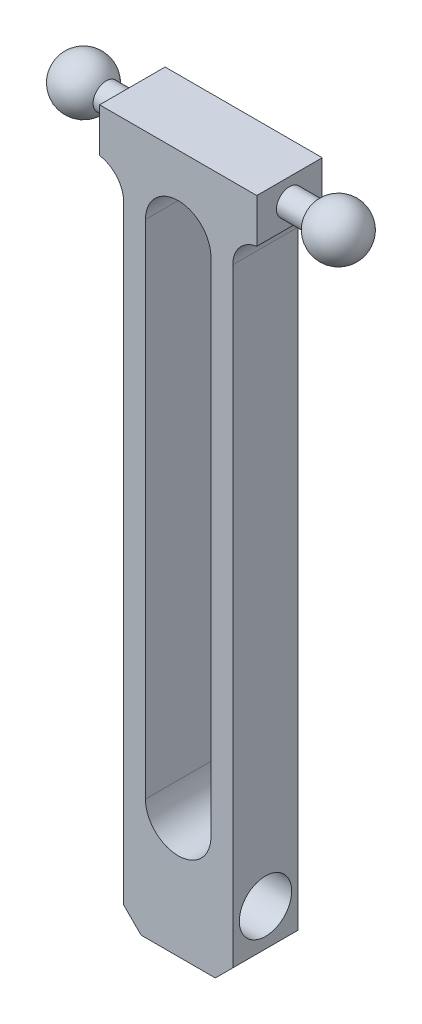
ISO-10303-21;
HEADER;
FILE_DESCRIPTION(('STEP AP214'),'2;1');
FILE_NAME('part.step','',(''),(''),'','','');
FILE_SCHEMA(('AUTOMOTIVE_DESIGN { 1 0 10303 214 1 1 1 1 }'));
ENDSEC;
DATA;
#1=APPLICATION_CONTEXT('core data for automotive mechanical design processes');
#2=APPLICATION_PROTOCOL_DEFINITION('international standard','automotive_design',2000,#1);
#3=PRODUCT_CONTEXT('',#1,'mechanical');
#4=PRODUCT('Part','Part','',(#3));
#5=PRODUCT_RELATED_PRODUCT_CATEGORY('part','',(#4));
#6=PRODUCT_DEFINITION_FORMATION('','',#4);
#7=PRODUCT_DEFINITION_CONTEXT('part definition',#1,'design');
#8=PRODUCT_DEFINITION('design','',#6,#7);
#9=PRODUCT_DEFINITION_SHAPE('','',#8);
#10=(LENGTH_UNIT() NAMED_UNIT(*) SI_UNIT(.MILLI.,.METRE.));
#11=(NAMED_UNIT(*) PLANE_ANGLE_UNIT() SI_UNIT($,.RADIAN.));
#12=(NAMED_UNIT(*) SI_UNIT($,.STERADIAN.) SOLID_ANGLE_UNIT());
#13=UNCERTAINTY_MEASURE_WITH_UNIT(LENGTH_MEASURE(1.E-05),#10,'distance_accuracy_value','');
#14=(GEOMETRIC_REPRESENTATION_CONTEXT(3) GLOBAL_UNCERTAINTY_ASSIGNED_CONTEXT((#13)) GLOBAL_UNIT_ASSIGNED_CONTEXT((#10,
#11,#12)) REPRESENTATION_CONTEXT('',''));
#15=CARTESIAN_POINT('',(0.,0.,0.));
#16=DIRECTION('',(0.,0.,1.));
#17=DIRECTION('',(1.,0.,0.));
#18=AXIS2_PLACEMENT_3D('',#15,#16,#17);
#19=CARTESIAN_POINT('',(-2.75,77.5,3.75));
#20=DIRECTION('',(-1.,0.,0.));
#21=DIRECTION('',(0.,0.,1.));
#22=AXIS2_PLACEMENT_3D('',#19,#20,#21);
#23=CYLINDRICAL_SURFACE('',#22,1.5);
#24=CARTESIAN_POINT('',(-2.75,77.5,3.75));
#25=DIRECTION('',(-1.,0.,0.));
#26=DIRECTION('',(0.,0.,1.));
#27=AXIS2_PLACEMENT_3D('',#24,#25,#26);
#28=CIRCLE('',#27,1.5);
#29=CARTESIAN_POINT('',(-2.75,77.5,5.25));
#30=VERTEX_POINT('',#29);
#31=EDGE_CURVE('E314',#30,#30,#28,.T.);
#32=ORIENTED_EDGE('',*,*,#31,.T.);
#33=EDGE_LOOP('',(#32));
#34=FACE_BOUND('',#33,.T.);
#35=CARTESIAN_POINT('',(-5.75,77.5,3.75));
#36=DIRECTION('',(-1.,0.,0.));
#37=DIRECTION('',(0.,0.,1.));
#38=AXIS2_PLACEMENT_3D('',#35,#36,#37);
#39=CIRCLE('',#38,1.5);
#40=CARTESIAN_POINT('',(-5.75,77.5,5.25));
#41=VERTEX_POINT('',#40);
#42=EDGE_CURVE('E307',#41,#41,#39,.T.);
#43=ORIENTED_EDGE('',*,*,#42,.F.);
#44=EDGE_LOOP('',(#43));
#45=FACE_BOUND('',#44,.T.);
#46=ADVANCED_FACE('F47',(#34,#45),#23,.T.);
#47=CARTESIAN_POINT('',(15.2499999999999,77.5,3.75));
#48=DIRECTION('',(1.,0.,0.));
#49=DIRECTION('',(0.,0.,-1.));
#50=AXIS2_PLACEMENT_3D('',#47,#48,#49);
#51=CYLINDRICAL_SURFACE('',#50,1.5);
#52=CARTESIAN_POINT('',(15.2499999999999,77.5,3.75));
#53=DIRECTION('',(1.,0.,0.));
#54=DIRECTION('',(0.,0.,-1.));
#55=AXIS2_PLACEMENT_3D('',#52,#53,#54);
#56=CIRCLE('',#55,1.5);
#57=CARTESIAN_POINT('',(15.2499999999999,77.5,2.25));
#58=VERTEX_POINT('',#57);
#59=EDGE_CURVE('E324',#58,#58,#56,.T.);
#60=ORIENTED_EDGE('',*,*,#59,.T.);
#61=EDGE_LOOP('',(#60));
#62=FACE_BOUND('',#61,.T.);
#63=CARTESIAN_POINT('',(18.25,77.5,3.75));
#64=DIRECTION('',(-1.,0.,0.));
#65=DIRECTION('',(0.,0.,1.));
#66=AXIS2_PLACEMENT_3D('',#63,#64,#65);
#67=CIRCLE('',#66,1.5);
#68=CARTESIAN_POINT('',(18.25,77.5,5.25));
#69=VERTEX_POINT('',#68);
#70=EDGE_CURVE('E310',#69,#69,#67,.T.);
#71=ORIENTED_EDGE('',*,*,#70,.T.);
#72=EDGE_LOOP('',(#71));
#73=FACE_BOUND('',#72,.T.);
#74=ADVANCED_FACE('F284',(#62,#73),#51,.T.);
#75=CARTESIAN_POINT('',(-8.75,80.,7.5));
#76=DIRECTION('',(0.,-1.,0.));
#77=DIRECTION('',(0.,0.,-1.));
#78=AXIS2_PLACEMENT_3D('',#75,#76,#77);
#79=PLANE('',#78);
#80=DIRECTION('',(0.,0.,-1.));
#81=VECTOR('',#80,1.);
#82=CARTESIAN_POINT('',(-2.75,80.,7.5));
#83=LINE('',#82,#81);
#84=CARTESIAN_POINT('',(-2.75,80.,7.5));
#85=VERTEX_POINT('',#84);
#86=CARTESIAN_POINT('',(-2.75,80.,0.));
#87=VERTEX_POINT('',#86);
#88=EDGE_CURVE('E179',#85,#87,#83,.T.);
#89=ORIENTED_EDGE('',*,*,#88,.F.);
#90=DIRECTION('',(-1.,0.,0.));
#91=VECTOR('',#90,1.);
#92=CARTESIAN_POINT('',(-8.75,80.,7.5));
#93=LINE('',#92,#91);
#94=CARTESIAN_POINT('',(15.2499999999999,80.,7.5));
#95=VERTEX_POINT('',#94);
#96=EDGE_CURVE('E177',#95,#85,#93,.T.);
#97=ORIENTED_EDGE('',*,*,#96,.F.);
#98=DIRECTION('',(0.,0.,1.));
#99=VECTOR('',#98,1.);
#100=CARTESIAN_POINT('',(15.2499999999999,80.,7.5));
#101=LINE('',#100,#99);
#102=CARTESIAN_POINT('',(15.2499999999999,80.,0.));
#103=VERTEX_POINT('',#102);
#104=EDGE_CURVE('E328',#103,#95,#101,.T.);
#105=ORIENTED_EDGE('',*,*,#104,.F.);
#106=DIRECTION('',(-1.,0.,0.));
#107=VECTOR('',#106,1.);
#108=CARTESIAN_POINT('',(-8.75,80.,0.));
#109=LINE('',#108,#107);
#110=EDGE_CURVE('E210',#103,#87,#109,.T.);
#111=ORIENTED_EDGE('',*,*,#110,.T.);
#112=EDGE_LOOP('',(#89,#97,#105,#111));
#113=FACE_BOUND('',#112,.T.);
#114=ADVANCED_FACE('F287',(#113),#79,.F.);
#115=CARTESIAN_POINT('',(15.75,71.75,7.5));
#116=DIRECTION('',(0.,0.,1.));
#117=DIRECTION('',(1.,0.,0.));
#118=AXIS2_PLACEMENT_3D('',#115,#116,#117);
#119=PLANE('',#118);
#120=CARTESIAN_POINT('',(6.25,71.25,7.5));
#121=DIRECTION('',(0.,0.,1.));
#122=DIRECTION('',(1.,0.,0.));
#123=AXIS2_PLACEMENT_3D('',#120,#121,#122);
#124=CIRCLE('',#123,3.75);
#125=CARTESIAN_POINT('',(10.,71.25,7.5));
#126=VERTEX_POINT('',#125);
#127=CARTESIAN_POINT('',(2.50000000000001,71.25,7.5));
#128=VERTEX_POINT('',#127);
#129=EDGE_CURVE('E344',#126,#128,#124,.T.);
#130=ORIENTED_EDGE('',*,*,#129,.F.);
#131=DIRECTION('',(0.,1.,0.));
#132=VECTOR('',#131,1.);
#133=CARTESIAN_POINT('',(10.,71.25,7.5));
#134=LINE('',#133,#132);
#135=CARTESIAN_POINT('',(10.,13.75,7.5));
#136=VERTEX_POINT('',#135);
#137=EDGE_CURVE('E353',#136,#126,#134,.T.);
#138=ORIENTED_EDGE('',*,*,#137,.F.);
#139=CARTESIAN_POINT('',(6.25000000000001,13.75,7.5));
#140=DIRECTION('',(0.,0.,1.));
#141=DIRECTION('',(1.,0.,0.));
#142=AXIS2_PLACEMENT_3D('',#139,#140,#141);
#143=CIRCLE('',#142,3.75);
#144=CARTESIAN_POINT('',(2.50000000000001,13.75,7.5));
#145=VERTEX_POINT('',#144);
#146=EDGE_CURVE('E350',#145,#136,#143,.T.);
#147=ORIENTED_EDGE('',*,*,#146,.F.);
#148=DIRECTION('',(0.,-1.,0.));
#149=VECTOR('',#148,1.);
#150=CARTESIAN_POINT('',(2.5,71.25,7.5));
#151=LINE('',#150,#149);
#152=EDGE_CURVE('E347',#128,#145,#151,.T.);
#153=ORIENTED_EDGE('',*,*,#152,.F.);
#154=EDGE_LOOP('',(#130,#138,#147,#153));
#155=FACE_BOUND('',#154,.T.);
#156=ORIENTED_EDGE('',*,*,#96,.T.);
#157=DIRECTION('',(0.,-1.,0.));
#158=VECTOR('',#157,1.);
#159=CARTESIAN_POINT('',(-2.75,71.75,7.5));
#160=LINE('',#159,#158);
#161=CARTESIAN_POINT('',(-2.75,74.9613081446663,7.5));
#162=VERTEX_POINT('',#161);
#163=EDGE_CURVE('E165',#85,#162,#160,.T.);
#164=ORIENTED_EDGE('',*,*,#163,.T.);
#165=CARTESIAN_POINT('',(-3.25,71.75,7.5));
#166=DIRECTION('',(0.,0.,-1.));
#167=DIRECTION('',(-1.,0.,0.));
#168=AXIS2_PLACEMENT_3D('',#165,#166,#167);
#169=CIRCLE('',#168,3.25);
#170=CARTESIAN_POINT('',(0.,71.75,7.5));
#171=VERTEX_POINT('',#170);
#172=EDGE_CURVE('E173',#162,#171,#169,.T.);
#173=ORIENTED_EDGE('',*,*,#172,.T.);
#174=DIRECTION('',(0.,-1.,0.));
#175=VECTOR('',#174,1.);
#176=CARTESIAN_POINT('',(0.,2.,7.5));
#177=LINE('',#176,#175);
#178=CARTESIAN_POINT('',(0.,2.,7.5));
#179=VERTEX_POINT('',#178);
#180=EDGE_CURVE('E186',#171,#179,#177,.T.);
#181=ORIENTED_EDGE('',*,*,#180,.T.);
#182=DIRECTION('',(0.707106781186548,-0.707106781186548,0.));
#183=VECTOR('',#182,1.);
#184=CARTESIAN_POINT('',(0.,2.,7.5));
#185=LINE('',#184,#183);
#186=CARTESIAN_POINT('',(2.,0.,7.5));
#187=VERTEX_POINT('',#186);
#188=EDGE_CURVE('E190',#179,#187,#185,.T.);
#189=ORIENTED_EDGE('',*,*,#188,.T.);
#190=DIRECTION('',(1.,0.,0.));
#191=VECTOR('',#190,1.);
#192=CARTESIAN_POINT('',(2.,0.,7.5));
#193=LINE('',#192,#191);
#194=CARTESIAN_POINT('',(10.5,0.,7.5));
#195=VERTEX_POINT('',#194);
#196=EDGE_CURVE('E198',#187,#195,#193,.T.);
#197=ORIENTED_EDGE('',*,*,#196,.T.);
#198=DIRECTION('',(0.707106781186548,0.707106781186548,0.));
#199=VECTOR('',#198,1.);
#200=CARTESIAN_POINT('',(10.5,0.,7.5));
#201=LINE('',#200,#199);
#202=CARTESIAN_POINT('',(12.5,2.,7.5));
#203=VERTEX_POINT('',#202);
#204=EDGE_CURVE('E200',#195,#203,#201,.T.);
#205=ORIENTED_EDGE('',*,*,#204,.T.);
#206=DIRECTION('',(0.,1.,0.));
#207=VECTOR('',#206,1.);
#208=CARTESIAN_POINT('',(12.5,2.,7.5));
#209=LINE('',#208,#207);
#210=CARTESIAN_POINT('',(12.5,71.75,7.5));
#211=VERTEX_POINT('',#210);
#212=EDGE_CURVE('E202',#203,#211,#209,.T.);
#213=ORIENTED_EDGE('',*,*,#212,.T.);
#214=CARTESIAN_POINT('',(15.75,71.75,7.5));
#215=DIRECTION('',(0.,0.,-1.));
#216=DIRECTION('',(1.,0.,0.));
#217=AXIS2_PLACEMENT_3D('',#214,#215,#216);
#218=CIRCLE('',#217,3.25);
#219=CARTESIAN_POINT('',(15.2499999999999,74.9613081446663,7.5));
#220=VERTEX_POINT('',#219);
#221=EDGE_CURVE('E193',#211,#220,#218,.T.);
#222=ORIENTED_EDGE('',*,*,#221,.T.);
#223=DIRECTION('',(0.,1.,0.));
#224=VECTOR('',#223,1.);
#225=CARTESIAN_POINT('',(15.2499999999999,71.75,7.5));
#226=LINE('',#225,#224);
#227=EDGE_CURVE('E333',#220,#95,#226,.T.);
#228=ORIENTED_EDGE('',*,*,#227,.T.);
#229=EDGE_LOOP('',(#156,#164,#173,#181,#189,#197,#205,#213,#222,#228));
#230=FACE_BOUND('',#229,.T.);
#231=ADVANCED_FACE('F172',(#155,#230),#119,.T.);
#232=CARTESIAN_POINT('',(15.75,71.75,0.));
#233=DIRECTION('',(0.,0.,1.));
#234=DIRECTION('',(1.,0.,0.));
#235=AXIS2_PLACEMENT_3D('',#232,#233,#234);
#236=PLANE('',#235);
#237=DIRECTION('',(0.,1.,0.));
#238=VECTOR('',#237,1.);
#239=CARTESIAN_POINT('',(10.,71.75,0.));
#240=LINE('',#239,#238);
#241=CARTESIAN_POINT('',(10.,13.75,0.));
#242=VERTEX_POINT('',#241);
#243=CARTESIAN_POINT('',(10.,71.25,0.));
#244=VERTEX_POINT('',#243);
#245=EDGE_CURVE('E257',#242,#244,#240,.T.);
#246=ORIENTED_EDGE('',*,*,#245,.T.);
#247=CARTESIAN_POINT('',(6.25,71.25,0.));
#248=DIRECTION('',(0.,0.,1.));
#249=DIRECTION('',(1.,0.,0.));
#250=AXIS2_PLACEMENT_3D('',#247,#248,#249);
#251=CIRCLE('',#250,3.75);
#252=CARTESIAN_POINT('',(2.5,71.25,0.));
#253=VERTEX_POINT('',#252);
#254=EDGE_CURVE('E261',#244,#253,#251,.T.);
#255=ORIENTED_EDGE('',*,*,#254,.T.);
#256=DIRECTION('',(0.,-1.,0.));
#257=VECTOR('',#256,1.);
#258=CARTESIAN_POINT('',(2.50000000000001,71.75,0.));
#259=LINE('',#258,#257);
#260=CARTESIAN_POINT('',(2.50000000000001,13.75,0.));
#261=VERTEX_POINT('',#260);
#262=EDGE_CURVE('E249',#253,#261,#259,.T.);
#263=ORIENTED_EDGE('',*,*,#262,.T.);
#264=CARTESIAN_POINT('',(6.25000000000001,13.75,0.));
#265=DIRECTION('',(0.,0.,1.));
#266=DIRECTION('',(1.,0.,0.));
#267=AXIS2_PLACEMENT_3D('',#264,#265,#266);
#268=CIRCLE('',#267,3.75);
#269=EDGE_CURVE('E253',#261,#242,#268,.T.);
#270=ORIENTED_EDGE('',*,*,#269,.T.);
#271=EDGE_LOOP('',(#246,#255,#263,#270));
#272=FACE_BOUND('',#271,.T.);
#273=DIRECTION('',(0.,-1.,0.));
#274=VECTOR('',#273,1.);
#275=CARTESIAN_POINT('',(-2.75,71.75,0.));
#276=LINE('',#275,#274);
#277=CARTESIAN_POINT('',(-2.75,74.9613081446663,0.));
#278=VERTEX_POINT('',#277);
#279=EDGE_CURVE('E65',#87,#278,#276,.T.);
#280=ORIENTED_EDGE('',*,*,#279,.F.);
#281=ORIENTED_EDGE('',*,*,#110,.F.);
#282=DIRECTION('',(0.,1.,0.));
#283=VECTOR('',#282,1.);
#284=CARTESIAN_POINT('',(15.2499999999999,71.75,0.));
#285=LINE('',#284,#283);
#286=CARTESIAN_POINT('',(15.2499999999999,74.9613081446663,0.));
#287=VERTEX_POINT('',#286);
#288=EDGE_CURVE('E56',#287,#103,#285,.T.);
#289=ORIENTED_EDGE('',*,*,#288,.F.);
#290=CARTESIAN_POINT('',(15.75,71.75,0.));
#291=DIRECTION('',(0.,0.,-1.));
#292=DIRECTION('',(1.,0.,0.));
#293=AXIS2_PLACEMENT_3D('',#290,#291,#292);
#294=CIRCLE('',#293,3.25);
#295=CARTESIAN_POINT('',(12.5,71.75,0.));
#296=VERTEX_POINT('',#295);
#297=EDGE_CURVE('E206',#296,#287,#294,.T.);
#298=ORIENTED_EDGE('',*,*,#297,.F.);
#299=DIRECTION('',(0.,1.,0.));
#300=VECTOR('',#299,1.);
#301=CARTESIAN_POINT('',(12.5,2.,0.));
#302=LINE('',#301,#300);
#303=CARTESIAN_POINT('',(12.5,2.,0.));
#304=VERTEX_POINT('',#303);
#305=EDGE_CURVE('E228',#304,#296,#302,.T.);
#306=ORIENTED_EDGE('',*,*,#305,.F.);
#307=DIRECTION('',(0.707106781186548,0.707106781186548,0.));
#308=VECTOR('',#307,1.);
#309=CARTESIAN_POINT('',(10.5,0.,0.));
#310=LINE('',#309,#308);
#311=CARTESIAN_POINT('',(10.5,0.,0.));
#312=VERTEX_POINT('',#311);
#313=EDGE_CURVE('E225',#312,#304,#310,.T.);
#314=ORIENTED_EDGE('',*,*,#313,.F.);
#315=DIRECTION('',(1.,0.,0.));
#316=VECTOR('',#315,1.);
#317=CARTESIAN_POINT('',(2.,0.,0.));
#318=LINE('',#317,#316);
#319=CARTESIAN_POINT('',(2.,0.,0.));
#320=VERTEX_POINT('',#319);
#321=EDGE_CURVE('E223',#320,#312,#318,.T.);
#322=ORIENTED_EDGE('',*,*,#321,.F.);
#323=DIRECTION('',(0.707106781186548,-0.707106781186548,0.));
#324=VECTOR('',#323,1.);
#325=CARTESIAN_POINT('',(0.,2.,0.));
#326=LINE('',#325,#324);
#327=CARTESIAN_POINT('',(0.,2.,0.));
#328=VERTEX_POINT('',#327);
#329=EDGE_CURVE('E221',#328,#320,#326,.T.);
#330=ORIENTED_EDGE('',*,*,#329,.F.);
#331=DIRECTION('',(0.,-1.,0.));
#332=VECTOR('',#331,1.);
#333=CARTESIAN_POINT('',(0.,2.,0.));
#334=LINE('',#333,#332);
#335=CARTESIAN_POINT('',(0.,71.75,0.));
#336=VERTEX_POINT('',#335);
#337=EDGE_CURVE('E218',#336,#328,#334,.T.);
#338=ORIENTED_EDGE('',*,*,#337,.F.);
#339=CARTESIAN_POINT('',(-3.25,71.75,0.));
#340=DIRECTION('',(0.,0.,-1.));
#341=DIRECTION('',(-1.,0.,0.));
#342=AXIS2_PLACEMENT_3D('',#339,#340,#341);
#343=CIRCLE('',#342,3.25);
#344=EDGE_CURVE('E215',#278,#336,#343,.T.);
#345=ORIENTED_EDGE('',*,*,#344,.F.);
#346=EDGE_LOOP('',(#280,#281,#289,#298,#306,#314,#322,#330,#338,#345));
#347=FACE_BOUND('',#346,.T.);
#348=ADVANCED_FACE('F376',(#272,#347),#236,.F.);
#349=CARTESIAN_POINT('',(-3.25,71.75,7.5));
#350=DIRECTION('',(0.,0.,-1.));
#351=DIRECTION('',(-1.,0.,0.));
#352=AXIS2_PLACEMENT_3D('',#349,#350,#351);
#353=CYLINDRICAL_SURFACE('',#352,3.25);
#354=DIRECTION('',(0.,0.,-1.));
#355=VECTOR('',#354,1.);
#356=CARTESIAN_POINT('',(-2.75,74.9613081446663,7.5));
#357=LINE('',#356,#355);
#358=EDGE_CURVE('E13',#278,#162,#357,.F.);
#359=ORIENTED_EDGE('',*,*,#358,.F.);
#360=ORIENTED_EDGE('',*,*,#344,.T.);
#361=DIRECTION('',(0.,0.,-1.));
#362=VECTOR('',#361,1.);
#363=CARTESIAN_POINT('',(0.,71.75,7.5));
#364=LINE('',#363,#362);
#365=EDGE_CURVE('E183',#171,#336,#364,.T.);
#366=ORIENTED_EDGE('',*,*,#365,.F.);
#367=ORIENTED_EDGE('',*,*,#172,.F.);
#368=EDGE_LOOP('',(#359,#360,#366,#367));
#369=FACE_BOUND('',#368,.T.);
#370=ADVANCED_FACE('F181',(#369),#353,.F.);
#371=CARTESIAN_POINT('',(15.75,71.75,7.5));
#372=DIRECTION('',(0.,0.,-1.));
#373=DIRECTION('',(-1.,0.,0.));
#374=AXIS2_PLACEMENT_3D('',#371,#372,#373);
#375=CYLINDRICAL_SURFACE('',#374,3.25);
#376=DIRECTION('',(0.,0.,-1.));
#377=VECTOR('',#376,1.);
#378=CARTESIAN_POINT('',(15.2499999999999,74.9613081446663,7.5));
#379=LINE('',#378,#377);
#380=EDGE_CURVE('E76',#220,#287,#379,.T.);
#381=ORIENTED_EDGE('',*,*,#380,.F.);
#382=ORIENTED_EDGE('',*,*,#221,.F.);
#383=DIRECTION('',(0.,0.,-1.));
#384=VECTOR('',#383,1.);
#385=CARTESIAN_POINT('',(12.5,71.75,7.5));
#386=LINE('',#385,#384);
#387=EDGE_CURVE('E205',#211,#296,#386,.T.);
#388=ORIENTED_EDGE('',*,*,#387,.T.);
#389=ORIENTED_EDGE('',*,*,#297,.T.);
#390=EDGE_LOOP('',(#381,#382,#388,#389));
#391=FACE_BOUND('',#390,.T.);
#392=ADVANCED_FACE('F49',(#391),#375,.F.);
#393=CARTESIAN_POINT('',(0.,2.,7.5));
#394=DIRECTION('',(1.,0.,0.));
#395=DIRECTION('',(0.,0.,-1.));
#396=AXIS2_PLACEMENT_3D('',#393,#394,#395);
#397=PLANE('',#396);
#398=CARTESIAN_POINT('',(0.,6.25,3.75));
#399=DIRECTION('',(1.,0.,0.));
#400=DIRECTION('',(0.,0.,-1.));
#401=AXIS2_PLACEMENT_3D('',#398,#399,#400);
#402=CIRCLE('',#401,3.);
#403=CARTESIAN_POINT('',(0.,6.25,0.75));
#404=VERTEX_POINT('',#403);
#405=EDGE_CURVE('E341',#404,#404,#402,.T.);
#406=ORIENTED_EDGE('',*,*,#405,.T.);
#407=EDGE_LOOP('',(#406));
#408=FACE_BOUND('',#407,.T.);
#409=ORIENTED_EDGE('',*,*,#337,.T.);
#410=DIRECTION('',(0.,0.,-1.));
#411=VECTOR('',#410,1.);
#412=CARTESIAN_POINT('',(0.,2.,7.5));
#413=LINE('',#412,#411);
#414=EDGE_CURVE('E244',#179,#328,#413,.T.);
#415=ORIENTED_EDGE('',*,*,#414,.F.);
#416=ORIENTED_EDGE('',*,*,#180,.F.);
#417=ORIENTED_EDGE('',*,*,#365,.T.);
#418=EDGE_LOOP('',(#409,#415,#416,#417));
#419=FACE_BOUND('',#418,.T.);
#420=ADVANCED_FACE('F386',(#408,#419),#397,.F.);
#421=CARTESIAN_POINT('',(0.,2.,7.5));
#422=DIRECTION('',(0.707106781186547,0.707106781186547,0.));
#423=DIRECTION('',(-0.707106781186548,0.707106781186548,0.));
#424=AXIS2_PLACEMENT_3D('',#421,#422,#423);
#425=PLANE('',#424);
#426=ORIENTED_EDGE('',*,*,#329,.T.);
#427=DIRECTION('',(0.,0.,-1.));
#428=VECTOR('',#427,1.);
#429=CARTESIAN_POINT('',(2.,0.,7.5));
#430=LINE('',#429,#428);
#431=EDGE_CURVE('E241',#187,#320,#430,.T.);
#432=ORIENTED_EDGE('',*,*,#431,.F.);
#433=ORIENTED_EDGE('',*,*,#188,.F.);
#434=ORIENTED_EDGE('',*,*,#414,.T.);
#435=EDGE_LOOP('',(#426,#432,#433,#434));
#436=FACE_BOUND('',#435,.T.);
#437=ADVANCED_FACE('F393',(#436),#425,.F.);
#438=CARTESIAN_POINT('',(2.,0.,7.5));
#439=DIRECTION('',(0.,1.,0.));
#440=DIRECTION('',(0.,0.,1.));
#441=AXIS2_PLACEMENT_3D('',#438,#439,#440);
#442=PLANE('',#441);
#443=CARTESIAN_POINT('',(6.25,0.,3.75));
#444=DIRECTION('',(0.,-1.,0.));
#445=DIRECTION('',(0.,0.,-1.));
#446=AXIS2_PLACEMENT_3D('',#443,#444,#445);
#447=CIRCLE('',#446,1.65);
#448=CARTESIAN_POINT('',(6.25,0.,2.1));
#449=VERTEX_POINT('',#448);
#450=EDGE_CURVE('E272',#449,#449,#447,.T.);
#451=ORIENTED_EDGE('',*,*,#450,.F.);
#452=EDGE_LOOP('',(#451));
#453=FACE_BOUND('',#452,.T.);
#454=ORIENTED_EDGE('',*,*,#321,.T.);
#455=DIRECTION('',(0.,0.,-1.));
#456=VECTOR('',#455,1.);
#457=CARTESIAN_POINT('',(10.5,0.,7.5));
#458=LINE('',#457,#456);
#459=EDGE_CURVE('E238',#195,#312,#458,.T.);
#460=ORIENTED_EDGE('',*,*,#459,.F.);
#461=ORIENTED_EDGE('',*,*,#196,.F.);
#462=ORIENTED_EDGE('',*,*,#431,.T.);
#463=EDGE_LOOP('',(#454,#460,#461,#462));
#464=FACE_BOUND('',#463,.T.);
#465=ADVANCED_FACE('F396',(#453,#464),#442,.F.);
#466=CARTESIAN_POINT('',(10.5,0.,7.5));
#467=DIRECTION('',(-0.707106781186547,0.707106781186547,0.));
#468=DIRECTION('',(-0.707106781186548,-0.707106781186548,0.));
#469=AXIS2_PLACEMENT_3D('',#466,#467,#468);
#470=PLANE('',#469);
#471=ORIENTED_EDGE('',*,*,#313,.T.);
#472=DIRECTION('',(0.,0.,-1.));
#473=VECTOR('',#472,1.);
#474=CARTESIAN_POINT('',(12.5,2.,7.5));
#475=LINE('',#474,#473);
#476=EDGE_CURVE('E234',#203,#304,#475,.T.);
#477=ORIENTED_EDGE('',*,*,#476,.F.);
#478=ORIENTED_EDGE('',*,*,#204,.F.);
#479=ORIENTED_EDGE('',*,*,#459,.T.);
#480=EDGE_LOOP('',(#471,#477,#478,#479));
#481=FACE_BOUND('',#480,.T.);
#482=ADVANCED_FACE('F400',(#481),#470,.F.);
#483=CARTESIAN_POINT('',(12.5,2.,7.5));
#484=DIRECTION('',(-1.,0.,0.));
#485=DIRECTION('',(0.,0.,1.));
#486=AXIS2_PLACEMENT_3D('',#483,#484,#485);
#487=PLANE('',#486);
#488=CARTESIAN_POINT('',(12.5,6.25,3.75));
#489=DIRECTION('',(1.,0.,0.));
#490=DIRECTION('',(0.,1.,0.));
#491=AXIS2_PLACEMENT_3D('',#488,#489,#490);
#492=CIRCLE('',#491,3.);
#493=CARTESIAN_POINT('',(12.5,9.25,3.75));
#494=VERTEX_POINT('',#493);
#495=EDGE_CURVE('E271',#494,#494,#492,.T.);
#496=ORIENTED_EDGE('',*,*,#495,.F.);
#497=EDGE_LOOP('',(#496));
#498=FACE_BOUND('',#497,.T.);
#499=ORIENTED_EDGE('',*,*,#305,.T.);
#500=ORIENTED_EDGE('',*,*,#387,.F.);
#501=ORIENTED_EDGE('',*,*,#212,.F.);
#502=ORIENTED_EDGE('',*,*,#476,.T.);
#503=EDGE_LOOP('',(#499,#500,#501,#502));
#504=FACE_BOUND('',#503,.T.);
#505=ADVANCED_FACE('F402',(#498,#504),#487,.F.);
#506=CARTESIAN_POINT('',(6.25,71.25,-2.5));
#507=DIRECTION('',(0.,0.,1.));
#508=DIRECTION('',(1.,0.,0.));
#509=AXIS2_PLACEMENT_3D('',#506,#507,#508);
#510=CYLINDRICAL_SURFACE('',#509,3.75);
#511=DIRECTION('',(0.,0.,1.));
#512=VECTOR('',#511,1.);
#513=CARTESIAN_POINT('',(10.,71.25,-2.5));
#514=LINE('',#513,#512);
#515=EDGE_CURVE('E211',#244,#126,#514,.T.);
#516=ORIENTED_EDGE('',*,*,#515,.T.);
#517=ORIENTED_EDGE('',*,*,#129,.T.);
#518=DIRECTION('',(0.,0.,1.));
#519=VECTOR('',#518,1.);
#520=CARTESIAN_POINT('',(2.5,71.25,-2.5));
#521=LINE('',#520,#519);
#522=EDGE_CURVE('E357',#253,#128,#521,.T.);
#523=ORIENTED_EDGE('',*,*,#522,.F.);
#524=ORIENTED_EDGE('',*,*,#254,.F.);
#525=EDGE_LOOP('',(#516,#517,#523,#524));
#526=FACE_BOUND('',#525,.T.);
#527=ADVANCED_FACE('F404',(#526),#510,.F.);
#528=CARTESIAN_POINT('',(10.,71.25,-2.5));
#529=DIRECTION('',(1.,0.,0.));
#530=DIRECTION('',(0.,1.,0.));
#531=AXIS2_PLACEMENT_3D('',#528,#529,#530);
#532=PLANE('',#531);
#533=DIRECTION('',(0.,0.,1.));
#534=VECTOR('',#533,1.);
#535=CARTESIAN_POINT('',(10.,13.75,-2.5));
#536=LINE('',#535,#534);
#537=EDGE_CURVE('E360',#242,#136,#536,.T.);
#538=ORIENTED_EDGE('',*,*,#537,.T.);
#539=ORIENTED_EDGE('',*,*,#137,.T.);
#540=ORIENTED_EDGE('',*,*,#515,.F.);
#541=ORIENTED_EDGE('',*,*,#245,.F.);
#542=EDGE_LOOP('',(#538,#539,#540,#541));
#543=FACE_BOUND('',#542,.T.);
#544=ADVANCED_FACE('F411',(#543),#532,.F.);
#545=CARTESIAN_POINT('',(6.25000000000001,13.75,-2.5));
#546=DIRECTION('',(0.,0.,1.));
#547=DIRECTION('',(1.,0.,0.));
#548=AXIS2_PLACEMENT_3D('',#545,#546,#547);
#549=CYLINDRICAL_SURFACE('',#548,3.75);
#550=DIRECTION('',(0.,0.,1.));
#551=VECTOR('',#550,1.);
#552=CARTESIAN_POINT('',(2.50000000000001,13.75,-2.5));
#553=LINE('',#552,#551);
#554=EDGE_CURVE('E363',#261,#145,#553,.T.);
#555=ORIENTED_EDGE('',*,*,#554,.T.);
#556=ORIENTED_EDGE('',*,*,#146,.T.);
#557=ORIENTED_EDGE('',*,*,#537,.F.);
#558=ORIENTED_EDGE('',*,*,#269,.F.);
#559=EDGE_LOOP('',(#555,#556,#557,#558));
#560=FACE_BOUND('',#559,.T.);
#561=ADVANCED_FACE('F443',(#560),#549,.F.);
#562=CARTESIAN_POINT('',(2.5,71.25,-2.5));
#563=DIRECTION('',(-1.,0.,0.));
#564=DIRECTION('',(0.,-1.,0.));
#565=AXIS2_PLACEMENT_3D('',#562,#563,#564);
#566=PLANE('',#565);
#567=ORIENTED_EDGE('',*,*,#522,.T.);
#568=ORIENTED_EDGE('',*,*,#152,.T.);
#569=ORIENTED_EDGE('',*,*,#554,.F.);
#570=ORIENTED_EDGE('',*,*,#262,.F.);
#571=EDGE_LOOP('',(#567,#568,#569,#570));
#572=FACE_BOUND('',#571,.T.);
#573=ADVANCED_FACE('F440',(#572),#566,.F.);
#574=CARTESIAN_POINT('',(-8.75,6.25,3.75));
#575=DIRECTION('',(1.,0.,0.));
#576=DIRECTION('',(0.,1.,0.));
#577=AXIS2_PLACEMENT_3D('',#574,#575,#576);
#578=CYLINDRICAL_SURFACE('',#577,3.);
#579=CARTESIAN_POINT('',(6.25,3.74450603672648,2.1));
#580=CARTESIAN_POINT('',(6.33456224412422,3.74449709270854,2.10000641884485));
#581=CARTESIAN_POINT('',(6.41919841964375,3.74015721695366,2.10654587904492));
#582=CARTESIAN_POINT('',(6.5857580106561,3.72347694527906,2.13231642203872));
#583=CARTESIAN_POINT('',(6.66767660773709,3.7111230618666,2.15156890169481));
#584=CARTESIAN_POINT('',(6.82605815834165,3.68030485575939,2.20160866495879));
#585=CARTESIAN_POINT('',(6.90255166363978,3.66187871746232,2.23232402205485));
#586=CARTESIAN_POINT('',(7.04927074932326,3.62105426039296,2.30419631972684));
#587=CARTESIAN_POINT('',(7.11949501937877,3.5986551141326,2.34535543627298));
#588=CARTESIAN_POINT('',(7.25949302048609,3.54965772830514,2.44181012447897));
#589=CARTESIAN_POINT('',(7.32850385692035,3.52286389707157,2.49811402431472));
#590=CARTESIAN_POINT('',(7.45671542475616,3.4696659787767,2.62117750134932));
#591=CARTESIAN_POINT('',(7.51591027944563,3.4432621337497,2.68794329577718));
#592=CARTESIAN_POINT('',(7.62781278752496,3.39111744666043,2.83701596119766));
#593=CARTESIAN_POINT('',(7.67952708912563,3.36562817127672,2.92016499067375));
#594=CARTESIAN_POINT('',(7.76787790618033,3.3208362253522,3.09565044360211));
#595=CARTESIAN_POINT('',(7.80452591089576,3.30152884311583,3.18797979934032));
#596=CARTESIAN_POINT('',(7.85849398479963,3.27270617669609,3.37107714565683));
#597=CARTESIAN_POINT('',(7.87716814327195,3.26250999379445,3.46133623781169));
#598=CARTESIAN_POINT('',(7.89917477835194,3.25046879782472,3.64423115102807));
#599=CARTESIAN_POINT('',(7.90251888599857,3.24861745347504,3.73686511657271));
#600=CARTESIAN_POINT('',(7.8941598762631,3.25320873616292,3.91145694274338));
#601=CARTESIAN_POINT('',(7.88399569896196,3.25880319411737,3.99351703604242));
#602=CARTESIAN_POINT('',(7.85174386066673,3.27629860909363,4.15454893471368));
#603=CARTESIAN_POINT('',(7.82965528402605,3.28820005041256,4.23352050242581));
#604=CARTESIAN_POINT('',(7.77418240454989,3.31741207866715,4.38727942978641));
#605=CARTESIAN_POINT('',(7.74067904874512,3.33477952262451,4.46201258706549));
#606=CARTESIAN_POINT('',(7.66356855385775,3.37344578060583,4.60494174130534));
#607=CARTESIAN_POINT('',(7.61995818281495,3.39474585173755,4.67313563729812));
#608=CARTESIAN_POINT('',(7.51851524995847,3.44208185617562,4.80891717191853));
#609=CARTESIAN_POINT('',(7.4596560691274,3.46838079827465,4.87564617195585));
#610=CARTESIAN_POINT('',(7.33207579455025,3.5214436200022,4.99879377983835));
#611=CARTESIAN_POINT('',(7.26334455874152,3.54820795258613,5.05520164705459));
#612=CARTESIAN_POINT('',(7.11070204577057,3.60183739258621,5.16104757147093));
#613=CARTESIAN_POINT('',(7.02598782502349,3.62850506442471,5.20943898084593));
#614=CARTESIAN_POINT('',(6.8479123412443,3.67557330545188,5.29096072440202));
#615=CARTESIAN_POINT('',(6.75456122610489,3.69598111093367,5.32410870202277));
#616=CARTESIAN_POINT('',(6.56961756608595,3.72571131114628,5.371324807476));
#617=CARTESIAN_POINT('',(6.47849229281884,3.73579611824245,5.38671808149072));
#618=CARTESIAN_POINT('',(6.29443856739545,3.74578867716068,5.40197600548299));
#619=CARTESIAN_POINT('',(6.2015122989948,3.74570806671445,5.40185841284551));
#620=CARTESIAN_POINT('',(6.03101930322447,3.73618708364218,5.38731066997579));
#621=CARTESIAN_POINT('',(5.95318323721182,3.72810881719227,5.3749632757909));
#622=CARTESIAN_POINT('',(5.8009051572916,3.70569101683773,5.33963092545287));
#623=CARTESIAN_POINT('',(5.72646464880278,3.69134873501823,5.31664130047228));
#624=CARTESIAN_POINT('',(5.57943158565931,3.65735298947037,5.25974087534156));
#625=CARTESIAN_POINT('',(5.50704917930496,3.63750113804146,5.22541058671725));
#626=CARTESIAN_POINT('',(5.36863846701702,3.59482474371819,5.14715088074391));
#627=CARTESIAN_POINT('',(5.30261332801742,3.57199873240485,5.10321671440463));
#628=CARTESIAN_POINT('',(5.16782401716695,3.52161254019741,4.99890384728535));
#629=CARTESIAN_POINT('',(5.10028334454636,3.49387528789457,4.93702256034847));
#630=CARTESIAN_POINT('',(4.97605536541755,3.43978533522712,4.80259034248067));
#631=CARTESIAN_POINT('',(4.91937442339406,3.41343345330048,4.73003319859337));
#632=CARTESIAN_POINT('',(4.81581643522167,3.36344113825656,4.57159143201762));
#633=CARTESIAN_POINT('',(4.76958019221826,3.34000523715114,4.48521836449538));
#634=CARTESIAN_POINT('',(4.69278569462413,3.30019775101371,4.30426953618026));
#635=CARTESIAN_POINT('',(4.66221113943847,3.28381882395707,4.20970242408539));
#636=CARTESIAN_POINT('',(4.62069388160817,3.26137674932025,4.02541779799545));
#637=CARTESIAN_POINT('',(4.60806903065566,3.25443294567572,3.93618712942534));
#638=CARTESIAN_POINT('',(4.59756810656546,3.24866563141353,3.75661676308886));
#639=CARTESIAN_POINT('',(4.59968426418038,3.24983784324858,3.66627767457491));
#640=CARTESIAN_POINT('',(4.61766992846187,3.25968957572475,3.49564163370297));
#641=CARTESIAN_POINT('',(4.63229366679434,3.26768895328171,3.41516863695217));
#642=CARTESIAN_POINT('',(4.67296482199048,3.2895529897462,3.25801416612312));
#643=CARTESIAN_POINT('',(4.69901360195535,3.30341834850642,3.18133314567385));
#644=CARTESIAN_POINT('',(4.76261263203963,3.33640124814557,3.03091972051891));
#645=CARTESIAN_POINT('',(4.80052559404503,3.35568212059068,2.9573777037946));
#646=CARTESIAN_POINT('',(4.88632550148768,3.39768349385212,2.81745759473055));
#647=CARTESIAN_POINT('',(4.93421648059952,3.42040538470345,2.75108241615528));
#648=CARTESIAN_POINT('',(5.04492600165038,3.47025482874985,2.61927789370826));
#649=CARTESIAN_POINT('',(5.10882783372567,3.49758854059186,2.55483504394154));
#650=CARTESIAN_POINT('',(5.24650713755192,3.55176121462945,2.43709559297179));
#651=CARTESIAN_POINT('',(5.32029646527335,3.57859953815838,2.38381257308629));
#652=CARTESIAN_POINT('',(5.48172400005144,3.63054891911069,2.28654037655737));
#653=CARTESIAN_POINT('',(5.56995639859266,3.65542700910396,2.24340307251972));
#654=CARTESIAN_POINT('',(5.75417880040869,3.69747114415715,2.17319906730646));
#655=CARTESIAN_POINT('',(5.85014295282818,3.71466172463242,2.14608114849846));
#656=CARTESIAN_POINT('',(5.99780878305847,3.7323307458679,2.1186051340391));
#657=CARTESIAN_POINT('',(6.04787476415997,3.73686937386858,2.1116455595007));
#658=CARTESIAN_POINT('',(6.14861831240748,3.74295966763535,2.10234111924385));
#659=CARTESIAN_POINT('',(6.19929586596914,3.74451139962442,2.09999615121414));
#660=CARTESIAN_POINT('',(6.25,3.74450603672648,2.1));
#661=B_SPLINE_CURVE_WITH_KNOTS('',3,(#579,#580,#581,#582,#583,#584,#585,#586,#587,#588,#589,
#590,#591,#592,#593,#594,#595,#596,#597,#598,#599,#600,#601,#602,#603,#604,#605,#606,#607,#608,
#609,#610,#611,#612,#613,#614,#615,#616,#617,#618,#619,#620,#621,#622,#623,#624,#625,#626,#627,
#628,#629,#630,#631,#632,#633,#634,#635,#636,#637,#638,#639,#640,#641,#642,#643,#644,#645,#646,
#647,#648,#649,#650,#651,#652,#653,#654,#655,#656,#657,#658,#659,#660),.UNSPECIFIED.,.T.,.F.,(4,
2,2,2,2,2,2,2,2,2,2,2,2,2,2,2,2,2,2,2,2,2,2,2,2,2,2,2,2,2,2,2,2,2,2,2,2,2,2,2,4),(0.,
0.253471464978916,0.507370630471962,0.759702723718414,1.0120874338999,1.28998079678324,
1.56803993512379,1.86997289364919,2.17167517502776,2.44828286528195,2.72468065617497,
2.97213663093979,3.21961160997027,3.46975098230537,3.71997045333204,3.99717687977863,
4.27467015892956,4.57652503396566,4.8780296436106,5.15517475627462,5.43200258623578,
5.66859462056207,5.90529054812099,6.15196333618108,6.39875837770522,6.6846559935313,
6.97072065421034,7.27125286686232,7.57147164850533,7.84111747203332,8.11062118950829,
8.35604451303953,8.60149712555498,8.85533990697405,9.10928550569674,9.39243346006447,
9.67592402360686,9.97823556729932,10.2795752459721,10.4315619419379,10.5835452681421),.UNSPECIFIED.);
#662=CARTESIAN_POINT('',(6.25,3.74450603672648,2.1));
#663=VERTEX_POINT('',#662);
#664=EDGE_CURVE('E265',#663,#663,#661,.T.);
#665=ORIENTED_EDGE('',*,*,#664,.T.);
#666=EDGE_LOOP('',(#665));
#667=FACE_BOUND('',#666,.T.);
#668=ORIENTED_EDGE('',*,*,#495,.T.);
#669=EDGE_LOOP('',(#668));
#670=FACE_BOUND('',#669,.T.);
#671=ORIENTED_EDGE('',*,*,#405,.F.);
#672=EDGE_LOOP('',(#671));
#673=FACE_BOUND('',#672,.T.);
#674=ADVANCED_FACE('F273',(#667,#670,#673),#578,.F.);
#675=CARTESIAN_POINT('',(6.25,0.,3.75));
#676=DIRECTION('',(0.,-1.,0.));
#677=DIRECTION('',(0.,0.,-1.));
#678=AXIS2_PLACEMENT_3D('',#675,#676,#677);
#679=CYLINDRICAL_SURFACE('',#678,1.65);
#680=ORIENTED_EDGE('',*,*,#450,.T.);
#681=EDGE_LOOP('',(#680));
#682=FACE_BOUND('',#681,.T.);
#683=ORIENTED_EDGE('',*,*,#664,.F.);
#684=EDGE_LOOP('',(#683));
#685=FACE_BOUND('',#684,.T.);
#686=ADVANCED_FACE('F276',(#682,#685),#679,.F.);
#687=CARTESIAN_POINT('',(15.2499999999999,40.,3.75));
#688=DIRECTION('',(1.,0.,0.));
#689=DIRECTION('',(0.,0.,-1.));
#690=AXIS2_PLACEMENT_3D('',#687,#688,#689);
#691=PLANE('',#690);
#692=ORIENTED_EDGE('',*,*,#380,.T.);
#693=ORIENTED_EDGE('',*,*,#288,.T.);
#694=ORIENTED_EDGE('',*,*,#104,.T.);
#695=ORIENTED_EDGE('',*,*,#227,.F.);
#696=EDGE_LOOP('',(#692,#693,#694,#695));
#697=FACE_BOUND('',#696,.T.);
#698=ORIENTED_EDGE('',*,*,#59,.F.);
#699=EDGE_LOOP('',(#698));
#700=FACE_BOUND('',#699,.T.);
#701=ADVANCED_FACE('F280',(#697,#700),#691,.T.);
#702=CARTESIAN_POINT('',(-2.75,40.,3.75));
#703=DIRECTION('',(-1.,0.,0.));
#704=DIRECTION('',(0.,0.,1.));
#705=AXIS2_PLACEMENT_3D('',#702,#703,#704);
#706=PLANE('',#705);
#707=ORIENTED_EDGE('',*,*,#31,.F.);
#708=EDGE_LOOP('',(#707));
#709=FACE_BOUND('',#708,.T.);
#710=ORIENTED_EDGE('',*,*,#88,.T.);
#711=ORIENTED_EDGE('',*,*,#279,.T.);
#712=ORIENTED_EDGE('',*,*,#358,.T.);
#713=ORIENTED_EDGE('',*,*,#163,.F.);
#714=EDGE_LOOP('',(#710,#711,#712,#713));
#715=FACE_BOUND('',#714,.T.);
#716=ADVANCED_FACE('F164',(#709,#715),#706,.T.);
#717=CARTESIAN_POINT('',(20.8480762113533,77.5,3.75));
#718=DIRECTION('',(-1.,0.,0.));
#719=DIRECTION('',(0.,0.,-1.));
#720=AXIS2_PLACEMENT_3D('',#717,#718,#719);
#721=SPHERICAL_SURFACE('',#720,3.);
#722=ORIENTED_EDGE('',*,*,#70,.F.);
#723=EDGE_LOOP('',(#722));
#724=FACE_BOUND('',#723,.T.);
#725=ADVANCED_FACE('F291',(#724),#721,.T.);
#726=CARTESIAN_POINT('',(-8.34807621135332,77.5,3.75));
#727=DIRECTION('',(-1.,0.,0.));
#728=DIRECTION('',(0.,0.,-1.));
#729=AXIS2_PLACEMENT_3D('',#726,#727,#728);
#730=SPHERICAL_SURFACE('',#729,3.);
#731=ORIENTED_EDGE('',*,*,#42,.T.);
#732=EDGE_LOOP('',(#731));
#733=FACE_BOUND('',#732,.T.);
#734=ADVANCED_FACE('F298',(#733),#730,.T.);
#735=CLOSED_SHELL('',(#46,#74,#114,#231,#348,#370,#392,#420,#437,#465,#482,#505,#527,#544,#561,
#573,#674,#686,#701,#716,#725,#734));
#736=MANIFOLD_SOLID_BREP('B2',#735);
#737=ADVANCED_BREP_SHAPE_REPRESENTATION('',(#18,#736),#14);
#738=SHAPE_DEFINITION_REPRESENTATION(#9,#737);
ENDSEC;
END-ISO-10303-21;
